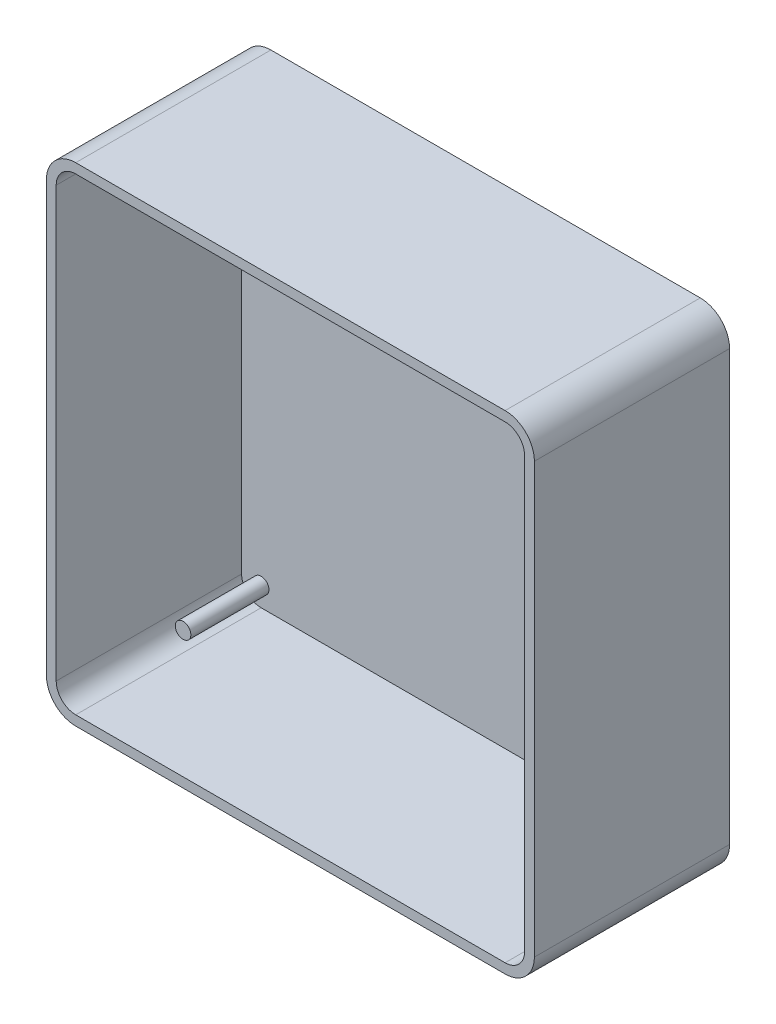
ISO-10303-21;
HEADER;
FILE_DESCRIPTION(('STEP AP214'),'2;1');
FILE_NAME('part.step','',(''),(''),'','','');
FILE_SCHEMA(('AUTOMOTIVE_DESIGN { 1 0 10303 214 1 1 1 1 }'));
ENDSEC;
DATA;
#1=APPLICATION_CONTEXT('core data for automotive mechanical design processes');
#2=APPLICATION_PROTOCOL_DEFINITION('international standard','automotive_design',2000,#1);
#3=PRODUCT_CONTEXT('',#1,'mechanical');
#4=PRODUCT('Part','Part','',(#3));
#5=PRODUCT_RELATED_PRODUCT_CATEGORY('part','',(#4));
#6=PRODUCT_DEFINITION_FORMATION('','',#4);
#7=PRODUCT_DEFINITION_CONTEXT('part definition',#1,'design');
#8=PRODUCT_DEFINITION('design','',#6,#7);
#9=PRODUCT_DEFINITION_SHAPE('','',#8);
#10=(LENGTH_UNIT() NAMED_UNIT(*) SI_UNIT(.MILLI.,.METRE.));
#11=(NAMED_UNIT(*) PLANE_ANGLE_UNIT() SI_UNIT($,.RADIAN.));
#12=(NAMED_UNIT(*) SI_UNIT($,.STERADIAN.) SOLID_ANGLE_UNIT());
#13=UNCERTAINTY_MEASURE_WITH_UNIT(LENGTH_MEASURE(1.E-05),#10,'distance_accuracy_value','');
#14=(GEOMETRIC_REPRESENTATION_CONTEXT(3) GLOBAL_UNCERTAINTY_ASSIGNED_CONTEXT((#13)) GLOBAL_UNIT_ASSIGNED_CONTEXT((#10,
#11,#12)) REPRESENTATION_CONTEXT('',''));
#15=CARTESIAN_POINT('',(0.,0.,0.));
#16=DIRECTION('',(0.,0.,1.));
#17=DIRECTION('',(1.,0.,0.));
#18=AXIS2_PLACEMENT_3D('',#15,#16,#17);
#19=CARTESIAN_POINT('',(22.,22.,1.));
#20=DIRECTION('',(0.,0.,-1.));
#21=DIRECTION('',(-1.,0.,0.));
#22=AXIS2_PLACEMENT_3D('',#19,#20,#21);
#23=CYLINDRICAL_SURFACE('',#22,3.);
#24=CARTESIAN_POINT('',(22.,22.,0.));
#25=DIRECTION('',(0.,0.,1.));
#26=DIRECTION('',(1.,0.,0.));
#27=AXIS2_PLACEMENT_3D('',#24,#25,#26);
#28=CIRCLE('',#27,3.);
#29=CARTESIAN_POINT('',(25.,22.,0.));
#30=VERTEX_POINT('',#29);
#31=CARTESIAN_POINT('',(22.,25.,0.));
#32=VERTEX_POINT('',#31);
#33=EDGE_CURVE('E167',#30,#32,#28,.T.);
#34=ORIENTED_EDGE('',*,*,#33,.T.);
#35=DIRECTION('',(0.,0.,-1.));
#36=VECTOR('',#35,1.);
#37=CARTESIAN_POINT('',(22.,25.,1.));
#38=LINE('',#37,#36);
#39=CARTESIAN_POINT('',(22.,25.,20.));
#40=VERTEX_POINT('',#39);
#41=EDGE_CURVE('E11',#40,#32,#38,.T.);
#42=ORIENTED_EDGE('',*,*,#41,.F.);
#43=CARTESIAN_POINT('',(22.,22.,20.));
#44=DIRECTION('',(0.,0.,1.));
#45=DIRECTION('',(1.,0.,0.));
#46=AXIS2_PLACEMENT_3D('',#43,#44,#45);
#47=CIRCLE('',#46,3.);
#48=CARTESIAN_POINT('',(25.,22.,20.));
#49=VERTEX_POINT('',#48);
#50=EDGE_CURVE('E204',#49,#40,#47,.T.);
#51=ORIENTED_EDGE('',*,*,#50,.F.);
#52=DIRECTION('',(0.,0.,-1.));
#53=VECTOR('',#52,1.);
#54=CARTESIAN_POINT('',(25.,22.,1.));
#55=LINE('',#54,#53);
#56=EDGE_CURVE('E279',#49,#30,#55,.T.);
#57=ORIENTED_EDGE('',*,*,#56,.T.);
#58=EDGE_LOOP('',(#34,#42,#51,#57));
#59=FACE_BOUND('',#58,.T.);
#60=ADVANCED_FACE('F47',(#59),#23,.T.);
#61=CARTESIAN_POINT('',(22.,25.,1.));
#62=DIRECTION('',(0.,-1.,0.));
#63=DIRECTION('',(1.,0.,0.));
#64=AXIS2_PLACEMENT_3D('',#61,#62,#63);
#65=PLANE('',#64);
#66=DIRECTION('',(-1.,0.,0.));
#67=VECTOR('',#66,1.);
#68=CARTESIAN_POINT('',(22.,25.,0.));
#69=LINE('',#68,#67);
#70=CARTESIAN_POINT('',(-22.,25.,0.));
#71=VERTEX_POINT('',#70);
#72=EDGE_CURVE('E258',#32,#71,#69,.T.);
#73=ORIENTED_EDGE('',*,*,#72,.T.);
#74=DIRECTION('',(0.,0.,-1.));
#75=VECTOR('',#74,1.);
#76=CARTESIAN_POINT('',(-22.,25.,1.));
#77=LINE('',#76,#75);
#78=CARTESIAN_POINT('',(-22.,25.,20.));
#79=VERTEX_POINT('',#78);
#80=EDGE_CURVE('E54',#79,#71,#77,.T.);
#81=ORIENTED_EDGE('',*,*,#80,.F.);
#82=DIRECTION('',(-1.,0.,0.));
#83=VECTOR('',#82,1.);
#84=CARTESIAN_POINT('',(0.,25.,20.));
#85=LINE('',#84,#83);
#86=EDGE_CURVE('E207',#40,#79,#85,.T.);
#87=ORIENTED_EDGE('',*,*,#86,.F.);
#88=ORIENTED_EDGE('',*,*,#41,.T.);
#89=EDGE_LOOP('',(#73,#81,#87,#88));
#90=FACE_BOUND('',#89,.T.);
#91=ADVANCED_FACE('F296',(#90),#65,.F.);
#92=CARTESIAN_POINT('',(-22.,22.,1.));
#93=DIRECTION('',(0.,0.,-1.));
#94=DIRECTION('',(-1.,0.,0.));
#95=AXIS2_PLACEMENT_3D('',#92,#93,#94);
#96=CYLINDRICAL_SURFACE('',#95,3.);
#97=CARTESIAN_POINT('',(-22.,22.,0.));
#98=DIRECTION('',(0.,0.,-1.));
#99=DIRECTION('',(-1.,0.,0.));
#100=AXIS2_PLACEMENT_3D('',#97,#98,#99);
#101=CIRCLE('',#100,3.);
#102=CARTESIAN_POINT('',(-25.,22.,0.));
#103=VERTEX_POINT('',#102);
#104=EDGE_CURVE('E261',#103,#71,#101,.T.);
#105=ORIENTED_EDGE('',*,*,#104,.F.);
#106=DIRECTION('',(0.,0.,-1.));
#107=VECTOR('',#106,1.);
#108=CARTESIAN_POINT('',(-25.,22.,1.));
#109=LINE('',#108,#107);
#110=CARTESIAN_POINT('',(-25.,22.,20.));
#111=VERTEX_POINT('',#110);
#112=EDGE_CURVE('E289',#111,#103,#109,.T.);
#113=ORIENTED_EDGE('',*,*,#112,.F.);
#114=CARTESIAN_POINT('',(-22.,22.,20.));
#115=DIRECTION('',(0.,0.,1.));
#116=DIRECTION('',(1.,0.,0.));
#117=AXIS2_PLACEMENT_3D('',#114,#115,#116);
#118=CIRCLE('',#117,3.);
#119=EDGE_CURVE('E210',#79,#111,#118,.T.);
#120=ORIENTED_EDGE('',*,*,#119,.F.);
#121=ORIENTED_EDGE('',*,*,#80,.T.);
#122=EDGE_LOOP('',(#105,#113,#120,#121));
#123=FACE_BOUND('',#122,.T.);
#124=ADVANCED_FACE('F293',(#123),#96,.T.);
#125=CARTESIAN_POINT('',(-25.,22.,1.));
#126=DIRECTION('',(1.,0.,0.));
#127=DIRECTION('',(0.,1.,0.));
#128=AXIS2_PLACEMENT_3D('',#125,#126,#127);
#129=PLANE('',#128);
#130=DIRECTION('',(0.,-1.,0.));
#131=VECTOR('',#130,1.);
#132=CARTESIAN_POINT('',(-25.,22.,0.));
#133=LINE('',#132,#131);
#134=CARTESIAN_POINT('',(-25.,-22.,0.));
#135=VERTEX_POINT('',#134);
#136=EDGE_CURVE('E264',#103,#135,#133,.T.);
#137=ORIENTED_EDGE('',*,*,#136,.T.);
#138=DIRECTION('',(0.,0.,-1.));
#139=VECTOR('',#138,1.);
#140=CARTESIAN_POINT('',(-25.,-22.,1.));
#141=LINE('',#140,#139);
#142=CARTESIAN_POINT('',(-25.,-22.,20.));
#143=VERTEX_POINT('',#142);
#144=EDGE_CURVE('E287',#143,#135,#141,.T.);
#145=ORIENTED_EDGE('',*,*,#144,.F.);
#146=DIRECTION('',(0.,-1.,0.));
#147=VECTOR('',#146,1.);
#148=CARTESIAN_POINT('',(-25.,0.,20.));
#149=LINE('',#148,#147);
#150=EDGE_CURVE('E213',#111,#143,#149,.T.);
#151=ORIENTED_EDGE('',*,*,#150,.F.);
#152=ORIENTED_EDGE('',*,*,#112,.T.);
#153=EDGE_LOOP('',(#137,#145,#151,#152));
#154=FACE_BOUND('',#153,.T.);
#155=ADVANCED_FACE('F303',(#154),#129,.F.);
#156=CARTESIAN_POINT('',(-22.,-22.,1.));
#157=DIRECTION('',(0.,0.,-1.));
#158=DIRECTION('',(-1.,0.,0.));
#159=AXIS2_PLACEMENT_3D('',#156,#157,#158);
#160=CYLINDRICAL_SURFACE('',#159,3.);
#161=CARTESIAN_POINT('',(-22.,-22.,0.));
#162=DIRECTION('',(0.,0.,-1.));
#163=DIRECTION('',(-1.,0.,0.));
#164=AXIS2_PLACEMENT_3D('',#161,#162,#163);
#165=CIRCLE('',#164,3.);
#166=CARTESIAN_POINT('',(-22.,-25.,0.));
#167=VERTEX_POINT('',#166);
#168=EDGE_CURVE('E267',#167,#135,#165,.T.);
#169=ORIENTED_EDGE('',*,*,#168,.F.);
#170=DIRECTION('',(0.,0.,-1.));
#171=VECTOR('',#170,1.);
#172=CARTESIAN_POINT('',(-22.,-25.,1.));
#173=LINE('',#172,#171);
#174=CARTESIAN_POINT('',(-22.,-25.,20.));
#175=VERTEX_POINT('',#174);
#176=EDGE_CURVE('E285',#175,#167,#173,.T.);
#177=ORIENTED_EDGE('',*,*,#176,.F.);
#178=CARTESIAN_POINT('',(-22.,-22.,20.));
#179=DIRECTION('',(0.,0.,1.));
#180=DIRECTION('',(1.,0.,0.));
#181=AXIS2_PLACEMENT_3D('',#178,#179,#180);
#182=CIRCLE('',#181,3.);
#183=EDGE_CURVE('E216',#143,#175,#182,.T.);
#184=ORIENTED_EDGE('',*,*,#183,.F.);
#185=ORIENTED_EDGE('',*,*,#144,.T.);
#186=EDGE_LOOP('',(#169,#177,#184,#185));
#187=FACE_BOUND('',#186,.T.);
#188=ADVANCED_FACE('F321',(#187),#160,.T.);
#189=CARTESIAN_POINT('',(22.,-25.,1.));
#190=DIRECTION('',(0.,-1.,0.));
#191=DIRECTION('',(1.,0.,0.));
#192=AXIS2_PLACEMENT_3D('',#189,#190,#191);
#193=PLANE('',#192);
#194=DIRECTION('',(-1.,0.,0.));
#195=VECTOR('',#194,1.);
#196=CARTESIAN_POINT('',(22.,-25.,0.));
#197=LINE('',#196,#195);
#198=CARTESIAN_POINT('',(22.,-25.,0.));
#199=VERTEX_POINT('',#198);
#200=EDGE_CURVE('E270',#199,#167,#197,.T.);
#201=ORIENTED_EDGE('',*,*,#200,.F.);
#202=DIRECTION('',(0.,0.,-1.));
#203=VECTOR('',#202,1.);
#204=CARTESIAN_POINT('',(22.,-25.,1.));
#205=LINE('',#204,#203);
#206=CARTESIAN_POINT('',(22.,-25.,20.));
#207=VERTEX_POINT('',#206);
#208=EDGE_CURVE('E283',#207,#199,#205,.T.);
#209=ORIENTED_EDGE('',*,*,#208,.F.);
#210=DIRECTION('',(1.,0.,0.));
#211=VECTOR('',#210,1.);
#212=CARTESIAN_POINT('',(0.,-25.,20.));
#213=LINE('',#212,#211);
#214=EDGE_CURVE('E219',#175,#207,#213,.T.);
#215=ORIENTED_EDGE('',*,*,#214,.F.);
#216=ORIENTED_EDGE('',*,*,#176,.T.);
#217=EDGE_LOOP('',(#201,#209,#215,#216));
#218=FACE_BOUND('',#217,.T.);
#219=ADVANCED_FACE('F318',(#218),#193,.T.);
#220=CARTESIAN_POINT('',(22.,-22.,1.));
#221=DIRECTION('',(0.,0.,-1.));
#222=DIRECTION('',(-1.,0.,0.));
#223=AXIS2_PLACEMENT_3D('',#220,#221,#222);
#224=CYLINDRICAL_SURFACE('',#223,3.);
#225=CARTESIAN_POINT('',(22.,-22.,0.));
#226=DIRECTION('',(0.,0.,1.));
#227=DIRECTION('',(1.,0.,0.));
#228=AXIS2_PLACEMENT_3D('',#225,#226,#227);
#229=CIRCLE('',#228,3.);
#230=CARTESIAN_POINT('',(25.,-22.,0.));
#231=VERTEX_POINT('',#230);
#232=EDGE_CURVE('E273',#199,#231,#229,.T.);
#233=ORIENTED_EDGE('',*,*,#232,.T.);
#234=DIRECTION('',(0.,0.,-1.));
#235=VECTOR('',#234,1.);
#236=CARTESIAN_POINT('',(25.,-22.,1.));
#237=LINE('',#236,#235);
#238=CARTESIAN_POINT('',(25.,-22.,20.));
#239=VERTEX_POINT('',#238);
#240=EDGE_CURVE('E281',#239,#231,#237,.T.);
#241=ORIENTED_EDGE('',*,*,#240,.F.);
#242=CARTESIAN_POINT('',(22.,-22.,20.));
#243=DIRECTION('',(0.,0.,1.));
#244=DIRECTION('',(1.,0.,0.));
#245=AXIS2_PLACEMENT_3D('',#242,#243,#244);
#246=CIRCLE('',#245,3.);
#247=EDGE_CURVE('E222',#207,#239,#246,.T.);
#248=ORIENTED_EDGE('',*,*,#247,.F.);
#249=ORIENTED_EDGE('',*,*,#208,.T.);
#250=EDGE_LOOP('',(#233,#241,#248,#249));
#251=FACE_BOUND('',#250,.T.);
#252=ADVANCED_FACE('F315',(#251),#224,.T.);
#253=CARTESIAN_POINT('',(25.,22.,1.));
#254=DIRECTION('',(1.,0.,0.));
#255=DIRECTION('',(0.,1.,0.));
#256=AXIS2_PLACEMENT_3D('',#253,#254,#255);
#257=PLANE('',#256);
#258=DIRECTION('',(0.,-1.,0.));
#259=VECTOR('',#258,1.);
#260=CARTESIAN_POINT('',(25.,22.,0.));
#261=LINE('',#260,#259);
#262=EDGE_CURVE('E276',#30,#231,#261,.T.);
#263=ORIENTED_EDGE('',*,*,#262,.F.);
#264=ORIENTED_EDGE('',*,*,#56,.F.);
#265=DIRECTION('',(0.,1.,0.));
#266=VECTOR('',#265,1.);
#267=CARTESIAN_POINT('',(25.,0.,20.));
#268=LINE('',#267,#266);
#269=EDGE_CURVE('E201',#239,#49,#268,.T.);
#270=ORIENTED_EDGE('',*,*,#269,.F.);
#271=ORIENTED_EDGE('',*,*,#240,.T.);
#272=EDGE_LOOP('',(#263,#264,#270,#271));
#273=FACE_BOUND('',#272,.T.);
#274=ADVANCED_FACE('F312',(#273),#257,.T.);
#275=CARTESIAN_POINT('',(22.,22.,0.));
#276=DIRECTION('',(0.,0.,1.));
#277=DIRECTION('',(1.,0.,0.));
#278=AXIS2_PLACEMENT_3D('',#275,#276,#277);
#279=PLANE('',#278);
#280=ORIENTED_EDGE('',*,*,#33,.F.);
#281=ORIENTED_EDGE('',*,*,#262,.T.);
#282=ORIENTED_EDGE('',*,*,#232,.F.);
#283=ORIENTED_EDGE('',*,*,#200,.T.);
#284=ORIENTED_EDGE('',*,*,#168,.T.);
#285=ORIENTED_EDGE('',*,*,#136,.F.);
#286=ORIENTED_EDGE('',*,*,#104,.T.);
#287=ORIENTED_EDGE('',*,*,#72,.F.);
#288=EDGE_LOOP('',(#280,#281,#282,#283,#284,#285,#286,#287));
#289=FACE_BOUND('',#288,.T.);
#290=ADVANCED_FACE('F300',(#289),#279,.F.);
#291=CARTESIAN_POINT('',(-22.,22.,20.));
#292=DIRECTION('',(0.,0.,-1.));
#293=DIRECTION('',(-1.,0.,0.));
#294=AXIS2_PLACEMENT_3D('',#291,#292,#293);
#295=CYLINDRICAL_SURFACE('',#294,2.);
#296=CARTESIAN_POINT('',(-22.,22.,1.));
#297=DIRECTION('',(0.,0.,1.));
#298=DIRECTION('',(1.,0.,0.));
#299=AXIS2_PLACEMENT_3D('',#296,#297,#298);
#300=CIRCLE('',#299,2.);
#301=CARTESIAN_POINT('',(-22.,24.,1.));
#302=VERTEX_POINT('',#301);
#303=CARTESIAN_POINT('',(-24.,22.,1.));
#304=VERTEX_POINT('',#303);
#305=EDGE_CURVE('E164',#302,#304,#300,.T.);
#306=ORIENTED_EDGE('',*,*,#305,.F.);
#307=DIRECTION('',(0.,0.,-1.));
#308=VECTOR('',#307,1.);
#309=CARTESIAN_POINT('',(-22.,24.,20.));
#310=LINE('',#309,#308);
#311=CARTESIAN_POINT('',(-22.,24.,20.));
#312=VERTEX_POINT('',#311);
#313=EDGE_CURVE('E158',#312,#302,#310,.T.);
#314=ORIENTED_EDGE('',*,*,#313,.F.);
#315=CARTESIAN_POINT('',(-22.,22.,20.));
#316=DIRECTION('',(0.,0.,1.));
#317=DIRECTION('',(1.,0.,0.));
#318=AXIS2_PLACEMENT_3D('',#315,#316,#317);
#319=CIRCLE('',#318,2.);
#320=CARTESIAN_POINT('',(-24.,22.,20.));
#321=VERTEX_POINT('',#320);
#322=EDGE_CURVE('E162',#312,#321,#319,.T.);
#323=ORIENTED_EDGE('',*,*,#322,.T.);
#324=DIRECTION('',(0.,0.,-1.));
#325=VECTOR('',#324,1.);
#326=CARTESIAN_POINT('',(-24.,22.,20.));
#327=LINE('',#326,#325);
#328=EDGE_CURVE('E225',#321,#304,#327,.T.);
#329=ORIENTED_EDGE('',*,*,#328,.T.);
#330=EDGE_LOOP('',(#306,#314,#323,#329));
#331=FACE_BOUND('',#330,.T.);
#332=ADVANCED_FACE('F160',(#331),#295,.F.);
#333=CARTESIAN_POINT('',(0.,24.,20.));
#334=DIRECTION('',(0.,-1.,0.));
#335=DIRECTION('',(1.,0.,0.));
#336=AXIS2_PLACEMENT_3D('',#333,#334,#335);
#337=PLANE('',#336);
#338=DIRECTION('',(-1.,0.,0.));
#339=VECTOR('',#338,1.);
#340=CARTESIAN_POINT('',(0.,24.,1.));
#341=LINE('',#340,#339);
#342=CARTESIAN_POINT('',(22.,24.,1.));
#343=VERTEX_POINT('',#342);
#344=EDGE_CURVE('E61',#343,#302,#341,.T.);
#345=ORIENTED_EDGE('',*,*,#344,.F.);
#346=DIRECTION('',(0.,0.,-1.));
#347=VECTOR('',#346,1.);
#348=CARTESIAN_POINT('',(22.,24.,20.));
#349=LINE('',#348,#347);
#350=CARTESIAN_POINT('',(22.,24.,20.));
#351=VERTEX_POINT('',#350);
#352=EDGE_CURVE('E168',#351,#343,#349,.T.);
#353=ORIENTED_EDGE('',*,*,#352,.F.);
#354=DIRECTION('',(-1.,0.,0.));
#355=VECTOR('',#354,1.);
#356=CARTESIAN_POINT('',(0.,24.,20.));
#357=LINE('',#356,#355);
#358=EDGE_CURVE('E175',#351,#312,#357,.T.);
#359=ORIENTED_EDGE('',*,*,#358,.T.);
#360=ORIENTED_EDGE('',*,*,#313,.T.);
#361=EDGE_LOOP('',(#345,#353,#359,#360));
#362=FACE_BOUND('',#361,.T.);
#363=ADVANCED_FACE('F182',(#362),#337,.T.);
#364=CARTESIAN_POINT('',(22.,22.,20.));
#365=DIRECTION('',(0.,0.,-1.));
#366=DIRECTION('',(-1.,0.,0.));
#367=AXIS2_PLACEMENT_3D('',#364,#365,#366);
#368=CYLINDRICAL_SURFACE('',#367,2.);
#369=CARTESIAN_POINT('',(22.,22.,1.));
#370=DIRECTION('',(0.,0.,1.));
#371=DIRECTION('',(1.,0.,0.));
#372=AXIS2_PLACEMENT_3D('',#369,#370,#371);
#373=CIRCLE('',#372,2.);
#374=CARTESIAN_POINT('',(24.,22.,1.));
#375=VERTEX_POINT('',#374);
#376=EDGE_CURVE('E66',#375,#343,#373,.T.);
#377=ORIENTED_EDGE('',*,*,#376,.F.);
#378=DIRECTION('',(0.,0.,-1.));
#379=VECTOR('',#378,1.);
#380=CARTESIAN_POINT('',(24.,22.,20.));
#381=LINE('',#380,#379);
#382=CARTESIAN_POINT('',(24.,22.,20.));
#383=VERTEX_POINT('',#382);
#384=EDGE_CURVE('E252',#383,#375,#381,.T.);
#385=ORIENTED_EDGE('',*,*,#384,.F.);
#386=CARTESIAN_POINT('',(22.,22.,20.));
#387=DIRECTION('',(0.,0.,1.));
#388=DIRECTION('',(1.,0.,0.));
#389=AXIS2_PLACEMENT_3D('',#386,#387,#388);
#390=CIRCLE('',#389,2.);
#391=EDGE_CURVE('E183',#383,#351,#390,.T.);
#392=ORIENTED_EDGE('',*,*,#391,.T.);
#393=ORIENTED_EDGE('',*,*,#352,.T.);
#394=EDGE_LOOP('',(#377,#385,#392,#393));
#395=FACE_BOUND('',#394,.T.);
#396=ADVANCED_FACE('F394',(#395),#368,.F.);
#397=CARTESIAN_POINT('',(24.,0.,20.));
#398=DIRECTION('',(-1.,0.,0.));
#399=DIRECTION('',(0.,-1.,0.));
#400=AXIS2_PLACEMENT_3D('',#397,#398,#399);
#401=PLANE('',#400);
#402=DIRECTION('',(0.,1.,0.));
#403=VECTOR('',#402,1.);
#404=CARTESIAN_POINT('',(24.,0.,1.));
#405=LINE('',#404,#403);
#406=CARTESIAN_POINT('',(24.,-22.,1.));
#407=VERTEX_POINT('',#406);
#408=EDGE_CURVE('E230',#407,#375,#405,.T.);
#409=ORIENTED_EDGE('',*,*,#408,.F.);
#410=DIRECTION('',(0.,0.,-1.));
#411=VECTOR('',#410,1.);
#412=CARTESIAN_POINT('',(24.,-22.,20.));
#413=LINE('',#412,#411);
#414=CARTESIAN_POINT('',(24.,-22.,20.));
#415=VERTEX_POINT('',#414);
#416=EDGE_CURVE('E249',#415,#407,#413,.T.);
#417=ORIENTED_EDGE('',*,*,#416,.F.);
#418=DIRECTION('',(0.,1.,0.));
#419=VECTOR('',#418,1.);
#420=CARTESIAN_POINT('',(24.,0.,20.));
#421=LINE('',#420,#419);
#422=EDGE_CURVE('E185',#415,#383,#421,.T.);
#423=ORIENTED_EDGE('',*,*,#422,.T.);
#424=ORIENTED_EDGE('',*,*,#384,.T.);
#425=EDGE_LOOP('',(#409,#417,#423,#424));
#426=FACE_BOUND('',#425,.T.);
#427=ADVANCED_FACE('F404',(#426),#401,.T.);
#428=CARTESIAN_POINT('',(22.,-22.,20.));
#429=DIRECTION('',(0.,0.,-1.));
#430=DIRECTION('',(-1.,0.,0.));
#431=AXIS2_PLACEMENT_3D('',#428,#429,#430);
#432=CYLINDRICAL_SURFACE('',#431,2.);
#433=CARTESIAN_POINT('',(22.,-22.,1.));
#434=DIRECTION('',(0.,0.,1.));
#435=DIRECTION('',(1.,0.,0.));
#436=AXIS2_PLACEMENT_3D('',#433,#434,#435);
#437=CIRCLE('',#436,2.);
#438=CARTESIAN_POINT('',(22.,-24.,1.));
#439=VERTEX_POINT('',#438);
#440=EDGE_CURVE('E232',#439,#407,#437,.T.);
#441=ORIENTED_EDGE('',*,*,#440,.F.);
#442=DIRECTION('',(0.,0.,-1.));
#443=VECTOR('',#442,1.);
#444=CARTESIAN_POINT('',(22.,-24.,20.));
#445=LINE('',#444,#443);
#446=CARTESIAN_POINT('',(22.,-24.,20.));
#447=VERTEX_POINT('',#446);
#448=EDGE_CURVE('E246',#447,#439,#445,.T.);
#449=ORIENTED_EDGE('',*,*,#448,.F.);
#450=CARTESIAN_POINT('',(22.,-22.,20.));
#451=DIRECTION('',(0.,0.,1.));
#452=DIRECTION('',(1.,0.,0.));
#453=AXIS2_PLACEMENT_3D('',#450,#451,#452);
#454=CIRCLE('',#453,2.);
#455=EDGE_CURVE('E191',#447,#415,#454,.T.);
#456=ORIENTED_EDGE('',*,*,#455,.T.);
#457=ORIENTED_EDGE('',*,*,#416,.T.);
#458=EDGE_LOOP('',(#441,#449,#456,#457));
#459=FACE_BOUND('',#458,.T.);
#460=ADVANCED_FACE('F415',(#459),#432,.F.);
#461=CARTESIAN_POINT('',(0.,-24.,20.));
#462=DIRECTION('',(0.,1.,0.));
#463=DIRECTION('',(-1.,0.,0.));
#464=AXIS2_PLACEMENT_3D('',#461,#462,#463);
#465=PLANE('',#464);
#466=DIRECTION('',(1.,0.,0.));
#467=VECTOR('',#466,1.);
#468=CARTESIAN_POINT('',(0.,-24.,1.));
#469=LINE('',#468,#467);
#470=CARTESIAN_POINT('',(-22.,-24.,1.));
#471=VERTEX_POINT('',#470);
#472=EDGE_CURVE('E234',#471,#439,#469,.T.);
#473=ORIENTED_EDGE('',*,*,#472,.F.);
#474=DIRECTION('',(0.,0.,-1.));
#475=VECTOR('',#474,1.);
#476=CARTESIAN_POINT('',(-22.,-24.,20.));
#477=LINE('',#476,#475);
#478=CARTESIAN_POINT('',(-22.,-24.,20.));
#479=VERTEX_POINT('',#478);
#480=EDGE_CURVE('E243',#479,#471,#477,.T.);
#481=ORIENTED_EDGE('',*,*,#480,.F.);
#482=DIRECTION('',(1.,0.,0.));
#483=VECTOR('',#482,1.);
#484=CARTESIAN_POINT('',(0.,-24.,20.));
#485=LINE('',#484,#483);
#486=EDGE_CURVE('E194',#479,#447,#485,.T.);
#487=ORIENTED_EDGE('',*,*,#486,.T.);
#488=ORIENTED_EDGE('',*,*,#448,.T.);
#489=EDGE_LOOP('',(#473,#481,#487,#488));
#490=FACE_BOUND('',#489,.T.);
#491=ADVANCED_FACE('F426',(#490),#465,.T.);
#492=CARTESIAN_POINT('',(-22.,-22.,20.));
#493=DIRECTION('',(0.,0.,-1.));
#494=DIRECTION('',(-1.,0.,0.));
#495=AXIS2_PLACEMENT_3D('',#492,#493,#494);
#496=CYLINDRICAL_SURFACE('',#495,2.);
#497=CARTESIAN_POINT('',(-22.,-22.,1.));
#498=DIRECTION('',(0.,0.,1.));
#499=DIRECTION('',(1.,0.,0.));
#500=AXIS2_PLACEMENT_3D('',#497,#498,#499);
#501=CIRCLE('',#500,2.);
#502=CARTESIAN_POINT('',(-24.,-22.,1.));
#503=VERTEX_POINT('',#502);
#504=EDGE_CURVE('E236',#503,#471,#501,.T.);
#505=ORIENTED_EDGE('',*,*,#504,.F.);
#506=DIRECTION('',(0.,0.,-1.));
#507=VECTOR('',#506,1.);
#508=CARTESIAN_POINT('',(-24.,-22.,20.));
#509=LINE('',#508,#507);
#510=CARTESIAN_POINT('',(-24.,-22.,20.));
#511=VERTEX_POINT('',#510);
#512=EDGE_CURVE('E240',#511,#503,#509,.T.);
#513=ORIENTED_EDGE('',*,*,#512,.F.);
#514=CARTESIAN_POINT('',(-22.,-22.,20.));
#515=DIRECTION('',(0.,0.,1.));
#516=DIRECTION('',(1.,0.,0.));
#517=AXIS2_PLACEMENT_3D('',#514,#515,#516);
#518=CIRCLE('',#517,2.);
#519=EDGE_CURVE('E197',#511,#479,#518,.T.);
#520=ORIENTED_EDGE('',*,*,#519,.T.);
#521=ORIENTED_EDGE('',*,*,#480,.T.);
#522=EDGE_LOOP('',(#505,#513,#520,#521));
#523=FACE_BOUND('',#522,.T.);
#524=ADVANCED_FACE('F437',(#523),#496,.F.);
#525=CARTESIAN_POINT('',(-24.,0.,20.));
#526=DIRECTION('',(1.,0.,0.));
#527=DIRECTION('',(0.,1.,0.));
#528=AXIS2_PLACEMENT_3D('',#525,#526,#527);
#529=PLANE('',#528);
#530=DIRECTION('',(0.,-1.,0.));
#531=VECTOR('',#530,1.);
#532=CARTESIAN_POINT('',(-24.,0.,1.));
#533=LINE('',#532,#531);
#534=EDGE_CURVE('E180',#304,#503,#533,.T.);
#535=ORIENTED_EDGE('',*,*,#534,.F.);
#536=ORIENTED_EDGE('',*,*,#328,.F.);
#537=DIRECTION('',(0.,-1.,0.));
#538=VECTOR('',#537,1.);
#539=CARTESIAN_POINT('',(-24.,0.,20.));
#540=LINE('',#539,#538);
#541=EDGE_CURVE('E179',#321,#511,#540,.T.);
#542=ORIENTED_EDGE('',*,*,#541,.T.);
#543=ORIENTED_EDGE('',*,*,#512,.T.);
#544=EDGE_LOOP('',(#535,#536,#542,#543));
#545=FACE_BOUND('',#544,.T.);
#546=ADVANCED_FACE('F448',(#545),#529,.T.);
#547=CARTESIAN_POINT('',(0.,0.,20.));
#548=DIRECTION('',(0.,0.,1.));
#549=DIRECTION('',(1.,0.,0.));
#550=AXIS2_PLACEMENT_3D('',#547,#548,#549);
#551=PLANE('',#550);
#552=ORIENTED_EDGE('',*,*,#322,.F.);
#553=ORIENTED_EDGE('',*,*,#358,.F.);
#554=ORIENTED_EDGE('',*,*,#391,.F.);
#555=ORIENTED_EDGE('',*,*,#422,.F.);
#556=ORIENTED_EDGE('',*,*,#455,.F.);
#557=ORIENTED_EDGE('',*,*,#486,.F.);
#558=ORIENTED_EDGE('',*,*,#519,.F.);
#559=ORIENTED_EDGE('',*,*,#541,.F.);
#560=EDGE_LOOP('',(#552,#553,#554,#555,#556,#557,#558,#559));
#561=FACE_BOUND('',#560,.T.);
#562=ORIENTED_EDGE('',*,*,#269,.T.);
#563=ORIENTED_EDGE('',*,*,#50,.T.);
#564=ORIENTED_EDGE('',*,*,#86,.T.);
#565=ORIENTED_EDGE('',*,*,#119,.T.);
#566=ORIENTED_EDGE('',*,*,#150,.T.);
#567=ORIENTED_EDGE('',*,*,#183,.T.);
#568=ORIENTED_EDGE('',*,*,#214,.T.);
#569=ORIENTED_EDGE('',*,*,#247,.T.);
#570=EDGE_LOOP('',(#562,#563,#564,#565,#566,#567,#568,#569));
#571=FACE_BOUND('',#570,.T.);
#572=ADVANCED_FACE('F172',(#561,#571),#551,.T.);
#573=CARTESIAN_POINT('',(22.,22.,1.));
#574=DIRECTION('',(0.,0.,1.));
#575=DIRECTION('',(1.,0.,0.));
#576=AXIS2_PLACEMENT_3D('',#573,#574,#575);
#577=PLANE('',#576);
#578=CARTESIAN_POINT('',(22.,-22.,1.));
#579=DIRECTION('',(0.,0.,1.));
#580=DIRECTION('',(1.,0.,0.));
#581=AXIS2_PLACEMENT_3D('',#578,#579,#580);
#582=CIRCLE('',#581,0.799999999999999);
#583=CARTESIAN_POINT('',(22.8,-22.,1.));
#584=VERTEX_POINT('',#583);
#585=EDGE_CURVE('E713',#584,#584,#582,.T.);
#586=ORIENTED_EDGE('',*,*,#585,.F.);
#587=EDGE_LOOP('',(#586));
#588=FACE_BOUND('',#587,.T.);
#589=CARTESIAN_POINT('',(22.,22.,1.));
#590=DIRECTION('',(0.,0.,1.));
#591=DIRECTION('',(1.,0.,0.));
#592=AXIS2_PLACEMENT_3D('',#589,#590,#591);
#593=CIRCLE('',#592,0.799999999999999);
#594=CARTESIAN_POINT('',(22.8,22.,1.));
#595=VERTEX_POINT('',#594);
#596=EDGE_CURVE('E723',#595,#595,#593,.T.);
#597=ORIENTED_EDGE('',*,*,#596,.F.);
#598=EDGE_LOOP('',(#597));
#599=FACE_BOUND('',#598,.T.);
#600=CARTESIAN_POINT('',(-22.,-22.,1.));
#601=DIRECTION('',(0.,0.,1.));
#602=DIRECTION('',(1.,0.,0.));
#603=AXIS2_PLACEMENT_3D('',#600,#601,#602);
#604=CIRCLE('',#603,0.799999999999999);
#605=CARTESIAN_POINT('',(-21.2,-22.,1.));
#606=VERTEX_POINT('',#605);
#607=EDGE_CURVE('E728',#606,#606,#604,.T.);
#608=ORIENTED_EDGE('',*,*,#607,.F.);
#609=EDGE_LOOP('',(#608));
#610=FACE_BOUND('',#609,.T.);
#611=CARTESIAN_POINT('',(-22.,22.,1.));
#612=DIRECTION('',(0.,0.,1.));
#613=DIRECTION('',(1.,0.,0.));
#614=AXIS2_PLACEMENT_3D('',#611,#612,#613);
#615=CIRCLE('',#614,0.799999999999999);
#616=CARTESIAN_POINT('',(-21.2,22.,1.));
#617=VERTEX_POINT('',#616);
#618=EDGE_CURVE('E740',#617,#617,#615,.T.);
#619=ORIENTED_EDGE('',*,*,#618,.F.);
#620=EDGE_LOOP('',(#619));
#621=FACE_BOUND('',#620,.T.);
#622=ORIENTED_EDGE('',*,*,#305,.T.);
#623=ORIENTED_EDGE('',*,*,#534,.T.);
#624=ORIENTED_EDGE('',*,*,#504,.T.);
#625=ORIENTED_EDGE('',*,*,#472,.T.);
#626=ORIENTED_EDGE('',*,*,#440,.T.);
#627=ORIENTED_EDGE('',*,*,#408,.T.);
#628=ORIENTED_EDGE('',*,*,#376,.T.);
#629=ORIENTED_EDGE('',*,*,#344,.T.);
#630=EDGE_LOOP('',(#622,#623,#624,#625,#626,#627,#628,#629));
#631=FACE_BOUND('',#630,.T.);
#632=ADVANCED_FACE('F470',(#588,#599,#610,#621,#631),#577,.T.);
#633=CARTESIAN_POINT('',(-22.,22.,9.));
#634=DIRECTION('',(0.,0.,-1.));
#635=DIRECTION('',(-1.,0.,0.));
#636=AXIS2_PLACEMENT_3D('',#633,#634,#635);
#637=CYLINDRICAL_SURFACE('',#636,0.799999999999999);
#638=CARTESIAN_POINT('',(-22.,22.,9.));
#639=DIRECTION('',(0.,0.,1.));
#640=DIRECTION('',(1.,0.,0.));
#641=AXIS2_PLACEMENT_3D('',#638,#639,#640);
#642=CIRCLE('',#641,0.799999999999999);
#643=CARTESIAN_POINT('',(-21.2,22.,9.));
#644=VERTEX_POINT('',#643);
#645=EDGE_CURVE('E227',#644,#644,#642,.T.);
#646=ORIENTED_EDGE('',*,*,#645,.F.);
#647=EDGE_LOOP('',(#646));
#648=FACE_BOUND('',#647,.T.);
#649=ORIENTED_EDGE('',*,*,#618,.T.);
#650=EDGE_LOOP('',(#649));
#651=FACE_BOUND('',#650,.T.);
#652=ADVANCED_FACE('F478',(#648,#651),#637,.T.);
#653=CARTESIAN_POINT('',(-22.,22.,9.));
#654=DIRECTION('',(0.,0.,1.));
#655=DIRECTION('',(1.,0.,0.));
#656=AXIS2_PLACEMENT_3D('',#653,#654,#655);
#657=PLANE('',#656);
#658=CARTESIAN_POINT('',(-22.,22.,9.));
#659=DIRECTION('',(0.,0.,1.));
#660=DIRECTION('',(1.,0.,0.));
#661=AXIS2_PLACEMENT_3D('',#658,#659,#660);
#662=CIRCLE('',#661,0.499999999999999);
#663=CARTESIAN_POINT('',(-21.5,22.,9.));
#664=VERTEX_POINT('',#663);
#665=EDGE_CURVE('E734',#664,#664,#662,.T.);
#666=ORIENTED_EDGE('',*,*,#665,.F.);
#667=EDGE_LOOP('',(#666));
#668=FACE_BOUND('',#667,.T.);
#669=ORIENTED_EDGE('',*,*,#645,.T.);
#670=EDGE_LOOP('',(#669));
#671=FACE_BOUND('',#670,.T.);
#672=ADVANCED_FACE('F482',(#668,#671),#657,.T.);
#673=CARTESIAN_POINT('',(-22.,22.,6.));
#674=DIRECTION('',(0.,0.,1.));
#675=DIRECTION('',(1.,0.,0.));
#676=AXIS2_PLACEMENT_3D('',#673,#674,#675);
#677=CYLINDRICAL_SURFACE('',#676,0.499999999999999);
#678=CARTESIAN_POINT('',(-22.,22.,6.));
#679=DIRECTION('',(0.,0.,1.));
#680=DIRECTION('',(1.,0.,0.));
#681=AXIS2_PLACEMENT_3D('',#678,#679,#680);
#682=CIRCLE('',#681,0.499999999999999);
#683=CARTESIAN_POINT('',(-21.5,22.,6.));
#684=VERTEX_POINT('',#683);
#685=EDGE_CURVE('E737',#684,#684,#682,.T.);
#686=ORIENTED_EDGE('',*,*,#685,.F.);
#687=EDGE_LOOP('',(#686));
#688=FACE_BOUND('',#687,.T.);
#689=ORIENTED_EDGE('',*,*,#665,.T.);
#690=EDGE_LOOP('',(#689));
#691=FACE_BOUND('',#690,.T.);
#692=ADVANCED_FACE('F495',(#688,#691),#677,.F.);
#693=CARTESIAN_POINT('',(-22.,22.,6.));
#694=DIRECTION('',(0.,0.,1.));
#695=DIRECTION('',(1.,0.,0.));
#696=AXIS2_PLACEMENT_3D('',#693,#694,#695);
#697=PLANE('',#696);
#698=ORIENTED_EDGE('',*,*,#685,.T.);
#699=EDGE_LOOP('',(#698));
#700=FACE_BOUND('',#699,.T.);
#701=ADVANCED_FACE('F506',(#700),#697,.T.);
#702=CARTESIAN_POINT('',(-22.,-22.,9.));
#703=DIRECTION('',(0.,0.,-1.));
#704=DIRECTION('',(-1.,0.,0.));
#705=AXIS2_PLACEMENT_3D('',#702,#703,#704);
#706=CYLINDRICAL_SURFACE('',#705,0.799999999999999);
#707=CARTESIAN_POINT('',(-22.,-22.,9.));
#708=DIRECTION('',(0.,0.,1.));
#709=DIRECTION('',(1.,0.,0.));
#710=AXIS2_PLACEMENT_3D('',#707,#708,#709);
#711=CIRCLE('',#710,0.799999999999999);
#712=CARTESIAN_POINT('',(-21.2,-22.,9.));
#713=VERTEX_POINT('',#712);
#714=EDGE_CURVE('E731',#713,#713,#711,.T.);
#715=ORIENTED_EDGE('',*,*,#714,.F.);
#716=EDGE_LOOP('',(#715));
#717=FACE_BOUND('',#716,.T.);
#718=ORIENTED_EDGE('',*,*,#607,.T.);
#719=EDGE_LOOP('',(#718));
#720=FACE_BOUND('',#719,.T.);
#721=ADVANCED_FACE('F517',(#717,#720),#706,.T.);
#722=CARTESIAN_POINT('',(-22.,-22.,9.));
#723=DIRECTION('',(0.,0.,1.));
#724=DIRECTION('',(1.,0.,0.));
#725=AXIS2_PLACEMENT_3D('',#722,#723,#724);
#726=PLANE('',#725);
#727=ORIENTED_EDGE('',*,*,#714,.T.);
#728=EDGE_LOOP('',(#727));
#729=FACE_BOUND('',#728,.T.);
#730=ADVANCED_FACE('F534',(#729),#726,.T.);
#731=CARTESIAN_POINT('',(22.,22.,9.));
#732=DIRECTION('',(0.,0.,-1.));
#733=DIRECTION('',(-1.,0.,0.));
#734=AXIS2_PLACEMENT_3D('',#731,#732,#733);
#735=CYLINDRICAL_SURFACE('',#734,0.799999999999999);
#736=CARTESIAN_POINT('',(22.,22.,9.));
#737=DIRECTION('',(0.,0.,1.));
#738=DIRECTION('',(1.,0.,0.));
#739=AXIS2_PLACEMENT_3D('',#736,#737,#738);
#740=CIRCLE('',#739,0.799999999999999);
#741=CARTESIAN_POINT('',(22.8,22.,9.));
#742=VERTEX_POINT('',#741);
#743=EDGE_CURVE('E725',#742,#742,#740,.T.);
#744=ORIENTED_EDGE('',*,*,#743,.F.);
#745=EDGE_LOOP('',(#744));
#746=FACE_BOUND('',#745,.T.);
#747=ORIENTED_EDGE('',*,*,#596,.T.);
#748=EDGE_LOOP('',(#747));
#749=FACE_BOUND('',#748,.T.);
#750=ADVANCED_FACE('F545',(#746,#749),#735,.T.);
#751=CARTESIAN_POINT('',(22.,22.,9.));
#752=DIRECTION('',(0.,0.,1.));
#753=DIRECTION('',(1.,0.,0.));
#754=AXIS2_PLACEMENT_3D('',#751,#752,#753);
#755=PLANE('',#754);
#756=CARTESIAN_POINT('',(22.,22.,9.));
#757=DIRECTION('',(0.,0.,1.));
#758=DIRECTION('',(1.,0.,0.));
#759=AXIS2_PLACEMENT_3D('',#756,#757,#758);
#760=CIRCLE('',#759,0.499999999999999);
#761=CARTESIAN_POINT('',(22.5,22.,9.));
#762=VERTEX_POINT('',#761);
#763=EDGE_CURVE('E714',#762,#762,#760,.T.);
#764=ORIENTED_EDGE('',*,*,#763,.F.);
#765=EDGE_LOOP('',(#764));
#766=FACE_BOUND('',#765,.T.);
#767=ORIENTED_EDGE('',*,*,#743,.T.);
#768=EDGE_LOOP('',(#767));
#769=FACE_BOUND('',#768,.T.);
#770=ADVANCED_FACE('F556',(#766,#769),#755,.T.);
#771=CARTESIAN_POINT('',(22.,-22.,9.));
#772=DIRECTION('',(0.,0.,-1.));
#773=DIRECTION('',(-1.,0.,0.));
#774=AXIS2_PLACEMENT_3D('',#771,#772,#773);
#775=CYLINDRICAL_SURFACE('',#774,0.799999999999999);
#776=CARTESIAN_POINT('',(22.,-22.,9.));
#777=DIRECTION('',(0.,0.,1.));
#778=DIRECTION('',(1.,0.,0.));
#779=AXIS2_PLACEMENT_3D('',#776,#777,#778);
#780=CIRCLE('',#779,0.799999999999999);
#781=CARTESIAN_POINT('',(22.8,-22.,9.));
#782=VERTEX_POINT('',#781);
#783=EDGE_CURVE('E717',#782,#782,#780,.T.);
#784=ORIENTED_EDGE('',*,*,#783,.F.);
#785=EDGE_LOOP('',(#784));
#786=FACE_BOUND('',#785,.T.);
#787=ORIENTED_EDGE('',*,*,#585,.T.);
#788=EDGE_LOOP('',(#787));
#789=FACE_BOUND('',#788,.T.);
#790=ADVANCED_FACE('F565',(#786,#789),#775,.T.);
#791=CARTESIAN_POINT('',(22.,-22.,9.));
#792=DIRECTION('',(0.,0.,1.));
#793=DIRECTION('',(1.,0.,0.));
#794=AXIS2_PLACEMENT_3D('',#791,#792,#793);
#795=PLANE('',#794);
#796=ORIENTED_EDGE('',*,*,#783,.T.);
#797=EDGE_LOOP('',(#796));
#798=FACE_BOUND('',#797,.T.);
#799=ADVANCED_FACE('F570',(#798),#795,.T.);
#800=CARTESIAN_POINT('',(22.,22.,6.));
#801=DIRECTION('',(0.,0.,1.));
#802=DIRECTION('',(1.,0.,0.));
#803=AXIS2_PLACEMENT_3D('',#800,#801,#802);
#804=CYLINDRICAL_SURFACE('',#803,0.499999999999999);
#805=CARTESIAN_POINT('',(22.,22.,6.));
#806=DIRECTION('',(0.,0.,1.));
#807=DIRECTION('',(1.,0.,0.));
#808=AXIS2_PLACEMENT_3D('',#805,#806,#807);
#809=CIRCLE('',#808,0.499999999999999);
#810=CARTESIAN_POINT('',(22.5,22.,6.));
#811=VERTEX_POINT('',#810);
#812=EDGE_CURVE('E712',#811,#811,#809,.T.);
#813=ORIENTED_EDGE('',*,*,#812,.F.);
#814=EDGE_LOOP('',(#813));
#815=FACE_BOUND('',#814,.T.);
#816=ORIENTED_EDGE('',*,*,#763,.T.);
#817=EDGE_LOOP('',(#816));
#818=FACE_BOUND('',#817,.T.);
#819=ADVANCED_FACE('F581',(#815,#818),#804,.F.);
#820=CARTESIAN_POINT('',(22.,22.,6.));
#821=DIRECTION('',(0.,0.,1.));
#822=DIRECTION('',(1.,0.,0.));
#823=AXIS2_PLACEMENT_3D('',#820,#821,#822);
#824=PLANE('',#823);
#825=ORIENTED_EDGE('',*,*,#812,.T.);
#826=EDGE_LOOP('',(#825));
#827=FACE_BOUND('',#826,.T.);
#828=ADVANCED_FACE('F600',(#827),#824,.T.);
#829=CLOSED_SHELL('',(#60,#91,#124,#155,#188,#219,#252,#274,#290,#332,#363,#396,#427,#460,#491,
#524,#546,#572,#632,#652,#672,#692,#701,#721,#730,#750,#770,#790,#799,#819,#828));
#830=MANIFOLD_SOLID_BREP('B2',#829);
#831=ADVANCED_BREP_SHAPE_REPRESENTATION('',(#18,#830),#14);
#832=SHAPE_DEFINITION_REPRESENTATION(#9,#831);
ENDSEC;
END-ISO-10303-21;
